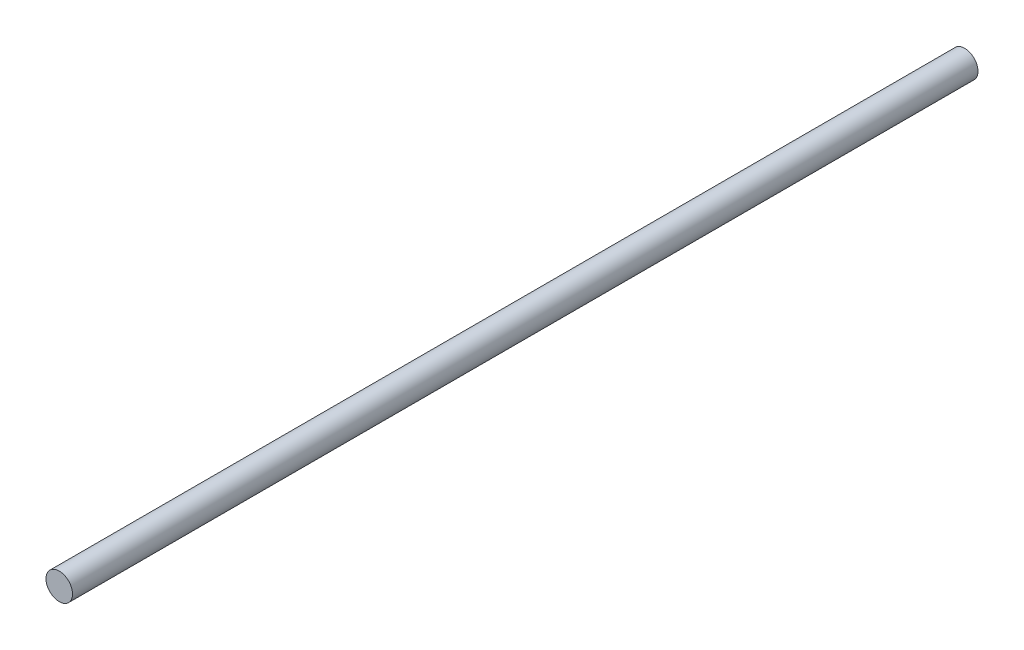
ISO-10303-21;
HEADER;
FILE_DESCRIPTION(('STEP AP214'),'2;1');
FILE_NAME('part.step','',(''),(''),'','','');
FILE_SCHEMA(('AUTOMOTIVE_DESIGN { 1 0 10303 214 1 1 1 1 }'));
ENDSEC;
DATA;
#1=APPLICATION_CONTEXT('core data for automotive mechanical design processes');
#2=APPLICATION_PROTOCOL_DEFINITION('international standard','automotive_design',2000,#1);
#3=PRODUCT_CONTEXT('',#1,'mechanical');
#4=PRODUCT('Part','Part','',(#3));
#5=PRODUCT_RELATED_PRODUCT_CATEGORY('part','',(#4));
#6=PRODUCT_DEFINITION_FORMATION('','',#4);
#7=PRODUCT_DEFINITION_CONTEXT('part definition',#1,'design');
#8=PRODUCT_DEFINITION('design','',#6,#7);
#9=PRODUCT_DEFINITION_SHAPE('','',#8);
#10=(LENGTH_UNIT() NAMED_UNIT(*) SI_UNIT(.MILLI.,.METRE.));
#11=(NAMED_UNIT(*) PLANE_ANGLE_UNIT() SI_UNIT($,.RADIAN.));
#12=(NAMED_UNIT(*) SI_UNIT($,.STERADIAN.) SOLID_ANGLE_UNIT());
#13=UNCERTAINTY_MEASURE_WITH_UNIT(LENGTH_MEASURE(1.E-05),#10,'distance_accuracy_value','');
#14=(GEOMETRIC_REPRESENTATION_CONTEXT(3) GLOBAL_UNCERTAINTY_ASSIGNED_CONTEXT((#13)) GLOBAL_UNIT_ASSIGNED_CONTEXT((#10,
#11,#12)) REPRESENTATION_CONTEXT('',''));
#15=CARTESIAN_POINT('',(0.,0.,0.));
#16=DIRECTION('',(0.,0.,1.));
#17=DIRECTION('',(1.,0.,0.));
#18=AXIS2_PLACEMENT_3D('',#15,#16,#17);
#19=CARTESIAN_POINT('',(0.,0.,682.34));
#20=DIRECTION('',(0.,0.,-1.));
#21=DIRECTION('',(-1.,0.,0.));
#22=AXIS2_PLACEMENT_3D('',#19,#20,#21);
#23=CYLINDRICAL_SURFACE('',#22,10.);
#24=CARTESIAN_POINT('',(0.,0.,682.34));
#25=DIRECTION('',(0.,0.,1.));
#26=DIRECTION('',(1.,0.,0.));
#27=AXIS2_PLACEMENT_3D('',#24,#25,#26);
#28=CIRCLE('',#27,10.);
#29=CARTESIAN_POINT('',(10.,0.,682.34));
#30=VERTEX_POINT('',#29);
#31=EDGE_CURVE('E10',#30,#30,#28,.T.);
#32=ORIENTED_EDGE('',*,*,#31,.F.);
#33=EDGE_LOOP('',(#32));
#34=FACE_BOUND('',#33,.T.);
#35=CARTESIAN_POINT('',(0.,0.,0.));
#36=DIRECTION('',(0.,0.,1.));
#37=DIRECTION('',(1.,0.,0.));
#38=AXIS2_PLACEMENT_3D('',#35,#36,#37);
#39=CIRCLE('',#38,10.);
#40=CARTESIAN_POINT('',(10.,0.,0.));
#41=VERTEX_POINT('',#40);
#42=EDGE_CURVE('E35',#41,#41,#39,.T.);
#43=ORIENTED_EDGE('',*,*,#42,.T.);
#44=EDGE_LOOP('',(#43));
#45=FACE_BOUND('',#44,.T.);
#46=ADVANCED_FACE('F32',(#34,#45),#23,.T.);
#47=CARTESIAN_POINT('',(0.,0.,682.34));
#48=DIRECTION('',(0.,0.,1.));
#49=DIRECTION('',(1.,0.,0.));
#50=AXIS2_PLACEMENT_3D('',#47,#48,#49);
#51=PLANE('',#50);
#52=ORIENTED_EDGE('',*,*,#31,.T.);
#53=EDGE_LOOP('',(#52));
#54=FACE_BOUND('',#53,.T.);
#55=ADVANCED_FACE('F47',(#54),#51,.T.);
#56=CARTESIAN_POINT('',(0.,0.,0.));
#57=DIRECTION('',(0.,0.,1.));
#58=DIRECTION('',(1.,0.,0.));
#59=AXIS2_PLACEMENT_3D('',#56,#57,#58);
#60=PLANE('',#59);
#61=ORIENTED_EDGE('',*,*,#42,.F.);
#62=EDGE_LOOP('',(#61));
#63=FACE_BOUND('',#62,.T.);
#64=ADVANCED_FACE('F45',(#63),#60,.F.);
#65=CLOSED_SHELL('',(#46,#55,#64));
#66=MANIFOLD_SOLID_BREP('B2',#65);
#67=ADVANCED_BREP_SHAPE_REPRESENTATION('',(#18,#66),#14);
#68=SHAPE_DEFINITION_REPRESENTATION(#9,#67);
ENDSEC;
END-ISO-10303-21;
